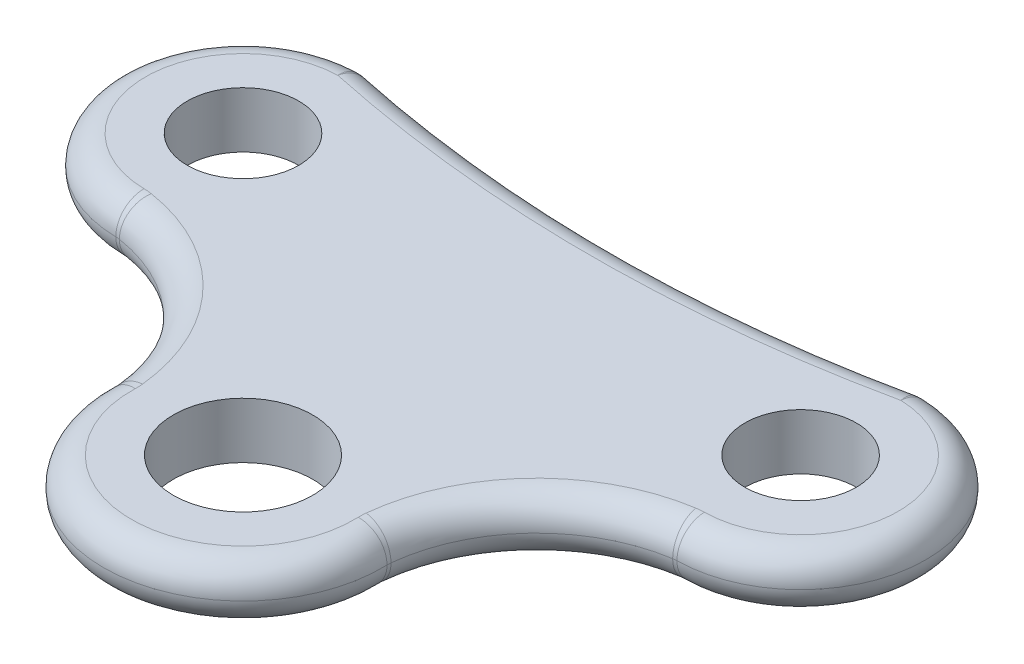
ISO-10303-21;
HEADER;
FILE_DESCRIPTION(('STEP AP214'),'2;1');
FILE_NAME('part.step','',(''),(''),'','','');
FILE_SCHEMA(('AUTOMOTIVE_DESIGN { 1 0 10303 214 1 1 1 1 }'));
ENDSEC;
DATA;
#1=APPLICATION_CONTEXT('core data for automotive mechanical design processes');
#2=APPLICATION_PROTOCOL_DEFINITION('international standard','automotive_design',2000,#1);
#3=PRODUCT_CONTEXT('',#1,'mechanical');
#4=PRODUCT('Part','Part','',(#3));
#5=PRODUCT_RELATED_PRODUCT_CATEGORY('part','',(#4));
#6=PRODUCT_DEFINITION_FORMATION('','',#4);
#7=PRODUCT_DEFINITION_CONTEXT('part definition',#1,'design');
#8=PRODUCT_DEFINITION('design','',#6,#7);
#9=PRODUCT_DEFINITION_SHAPE('','',#8);
#10=(LENGTH_UNIT() NAMED_UNIT(*) SI_UNIT(.MILLI.,.METRE.));
#11=(NAMED_UNIT(*) PLANE_ANGLE_UNIT() SI_UNIT($,.RADIAN.));
#12=(NAMED_UNIT(*) SI_UNIT($,.STERADIAN.) SOLID_ANGLE_UNIT());
#13=UNCERTAINTY_MEASURE_WITH_UNIT(LENGTH_MEASURE(1.E-05),#10,'distance_accuracy_value','');
#14=(GEOMETRIC_REPRESENTATION_CONTEXT(3) GLOBAL_UNCERTAINTY_ASSIGNED_CONTEXT((#13)) GLOBAL_UNIT_ASSIGNED_CONTEXT((#10,
#11,#12)) REPRESENTATION_CONTEXT('',''));
#15=CARTESIAN_POINT('',(0.,0.,0.));
#16=DIRECTION('',(0.,0.,1.));
#17=DIRECTION('',(1.,0.,0.));
#18=AXIS2_PLACEMENT_3D('',#15,#16,#17);
#19=CARTESIAN_POINT('',(-20.8323817746061,4.,-9.69746398010137));
#20=DIRECTION('',(0.,1.,0.));
#21=DIRECTION('',(0.,0.,1.));
#22=AXIS2_PLACEMENT_3D('',#19,#20,#21);
#23=PLANE('',#22);
#24=CARTESIAN_POINT('',(-20.1565010770898,4.,-9.0011133557587));
#25=DIRECTION('',(0.,1.,0.));
#26=DIRECTION('',(0.,0.,1.));
#27=AXIS2_PLACEMENT_3D('',#24,#25,#26);
#28=CIRCLE('',#27,4.);
#29=CARTESIAN_POINT('',(-19.5360639769768,4.,-12.9527026315822));
#30=VERTEX_POINT('',#29);
#31=CARTESIAN_POINT('',(-20.0995915945117,4.,-13.0007084991192));
#32=VERTEX_POINT('',#31);
#33=EDGE_CURVE('E318',#30,#32,#28,.T.);
#34=ORIENTED_EDGE('',*,*,#33,.F.);
#35=CARTESIAN_POINT('',(-21.6647635492123,4.,0.605072039797253));
#36=DIRECTION('',(0.,1.,0.));
#37=DIRECTION('',(0.,0.,1.));
#38=AXIS2_PLACEMENT_3D('',#35,#36,#37);
#39=CIRCLE('',#38,13.7238702962661);
#40=CARTESIAN_POINT('',(-8.01478016611198,4.,-0.817098677739674));
#41=VERTEX_POINT('',#40);
#42=EDGE_CURVE('E324',#30,#41,#39,.F.);
#43=ORIENTED_EDGE('',*,*,#42,.T.);
#44=CARTESIAN_POINT('',(-11.9932448669374,4.,-0.402588576190881));
#45=DIRECTION('',(0.,1.,0.));
#46=DIRECTION('',(0.,0.,1.));
#47=AXIS2_PLACEMENT_3D('',#44,#45,#46);
#48=CIRCLE('',#47,4.);
#49=CARTESIAN_POINT('',(-7.99549657795828,4.,-0.268392384127254));
#50=VERTEX_POINT('',#49);
#51=EDGE_CURVE('E321',#50,#41,#48,.T.);
#52=ORIENTED_EDGE('',*,*,#51,.F.);
#53=CARTESIAN_POINT('',(0.,4.,0.));
#54=DIRECTION('',(0.,1.,0.));
#55=DIRECTION('',(0.,0.,1.));
#56=AXIS2_PLACEMENT_3D('',#53,#54,#55);
#57=CIRCLE('',#56,8.);
#58=CARTESIAN_POINT('',(7.99549657795827,4.,-0.268392384127281));
#59=VERTEX_POINT('',#58);
#60=EDGE_CURVE('E316',#50,#59,#57,.T.);
#61=ORIENTED_EDGE('',*,*,#60,.T.);
#62=CARTESIAN_POINT('',(11.9932448669374,4.,-0.402588576190921));
#63=DIRECTION('',(0.,1.,0.));
#64=DIRECTION('',(0.,0.,1.));
#65=AXIS2_PLACEMENT_3D('',#62,#63,#64);
#66=CIRCLE('',#65,4.);
#67=CARTESIAN_POINT('',(8.01478016611198,4.,-0.817098677739704));
#68=VERTEX_POINT('',#67);
#69=EDGE_CURVE('E313',#68,#59,#66,.T.);
#70=ORIENTED_EDGE('',*,*,#69,.F.);
#71=CARTESIAN_POINT('',(21.6647635492122,4.,0.605072039797178));
#72=DIRECTION('',(0.,1.,0.));
#73=DIRECTION('',(0.,0.,1.));
#74=AXIS2_PLACEMENT_3D('',#71,#72,#73);
#75=CIRCLE('',#74,13.723870296266);
#76=CARTESIAN_POINT('',(19.5360639769768,4.,-12.9527026315822));
#77=VERTEX_POINT('',#76);
#78=EDGE_CURVE('E311',#68,#77,#75,.F.);
#79=ORIENTED_EDGE('',*,*,#78,.T.);
#80=CARTESIAN_POINT('',(20.1565010770897,4.,-9.0011133557587));
#81=DIRECTION('',(0.,1.,0.));
#82=DIRECTION('',(0.,0.,1.));
#83=AXIS2_PLACEMENT_3D('',#80,#81,#82);
#84=CIRCLE('',#83,4.);
#85=CARTESIAN_POINT('',(20.0995915945116,4.,-13.0007084991192));
#86=VERTEX_POINT('',#85);
#87=EDGE_CURVE('E308',#86,#77,#84,.T.);
#88=ORIENTED_EDGE('',*,*,#87,.F.);
#89=CARTESIAN_POINT('',(20.,4.,-20.));
#90=DIRECTION('',(0.,1.,0.));
#91=DIRECTION('',(0.,0.,1.));
#92=AXIS2_PLACEMENT_3D('',#89,#90,#91);
#93=CIRCLE('',#92,7.);
#94=CARTESIAN_POINT('',(20.1992785128255,4.,-26.9971628589255));
#95=VERTEX_POINT('',#94);
#96=EDGE_CURVE('E107',#86,#95,#93,.T.);
#97=ORIENTED_EDGE('',*,*,#96,.T.);
#98=CARTESIAN_POINT('',(0.,4.,-121.529007777522));
#99=DIRECTION('',(0.,1.,0.));
#100=DIRECTION('',(0.,0.,1.));
#101=AXIS2_PLACEMENT_3D('',#98,#99,#100);
#102=CIRCLE('',#101,96.6658189648865);
#103=CARTESIAN_POINT('',(-20.1992785128254,4.,-26.9971628589255));
#104=VERTEX_POINT('',#103);
#105=EDGE_CURVE('E301',#95,#104,#102,.F.);
#106=ORIENTED_EDGE('',*,*,#105,.T.);
#107=CARTESIAN_POINT('',(-20.,4.,-20.));
#108=DIRECTION('',(0.,1.,0.));
#109=DIRECTION('',(0.,0.,1.));
#110=AXIS2_PLACEMENT_3D('',#107,#108,#109);
#111=CIRCLE('',#110,7.);
#112=EDGE_CURVE('E306',#104,#32,#111,.T.);
#113=ORIENTED_EDGE('',*,*,#112,.T.);
#114=EDGE_LOOP('',(#34,#43,#52,#61,#70,#79,#88,#97,#106,#113));
#115=FACE_BOUND('',#114,.T.);
#116=CARTESIAN_POINT('',(-20.,4.,-20.));
#117=DIRECTION('',(0.,1.,0.));
#118=DIRECTION('',(0.,0.,1.));
#119=AXIS2_PLACEMENT_3D('',#116,#117,#118);
#120=CIRCLE('',#119,4.);
#121=CARTESIAN_POINT('',(-20.,4.,-16.));
#122=VERTEX_POINT('',#121);
#123=EDGE_CURVE('E292',#122,#122,#120,.T.);
#124=ORIENTED_EDGE('',*,*,#123,.F.);
#125=EDGE_LOOP('',(#124));
#126=FACE_BOUND('',#125,.T.);
#127=CARTESIAN_POINT('',(0.,4.,0.));
#128=DIRECTION('',(0.,1.,0.));
#129=DIRECTION('',(0.,0.,1.));
#130=AXIS2_PLACEMENT_3D('',#127,#128,#129);
#131=CIRCLE('',#130,5.);
#132=CARTESIAN_POINT('',(0.,4.,5.));
#133=VERTEX_POINT('',#132);
#134=EDGE_CURVE('E298',#133,#133,#131,.T.);
#135=ORIENTED_EDGE('',*,*,#134,.F.);
#136=EDGE_LOOP('',(#135));
#137=FACE_BOUND('',#136,.T.);
#138=CARTESIAN_POINT('',(20.,4.,-20.));
#139=DIRECTION('',(0.,1.,0.));
#140=DIRECTION('',(0.,0.,1.));
#141=AXIS2_PLACEMENT_3D('',#138,#139,#140);
#142=CIRCLE('',#141,4.);
#143=CARTESIAN_POINT('',(20.,4.,-16.));
#144=VERTEX_POINT('',#143);
#145=EDGE_CURVE('E284',#144,#144,#142,.T.);
#146=ORIENTED_EDGE('',*,*,#145,.F.);
#147=EDGE_LOOP('',(#146));
#148=FACE_BOUND('',#147,.T.);
#149=ADVANCED_FACE('F36',(#115,#126,#137,#148),#23,.T.);
#150=CARTESIAN_POINT('',(-20.8323817746061,0.,-9.69746398010137));
#151=DIRECTION('',(0.,1.,0.));
#152=DIRECTION('',(0.,0.,1.));
#153=AXIS2_PLACEMENT_3D('',#150,#151,#152);
#154=PLANE('',#153);
#155=CARTESIAN_POINT('',(20.1565010770897,0.,-9.0011133557587));
#156=DIRECTION('',(0.,1.,0.));
#157=DIRECTION('',(0.,0.,1.));
#158=AXIS2_PLACEMENT_3D('',#155,#156,#157);
#159=CIRCLE('',#158,4.);
#160=CARTESIAN_POINT('',(19.5360639769768,0.,-12.9527026315822));
#161=VERTEX_POINT('',#160);
#162=CARTESIAN_POINT('',(20.0995915945116,0.,-13.0007084991192));
#163=VERTEX_POINT('',#162);
#164=EDGE_CURVE('E182',#161,#163,#159,.F.);
#165=ORIENTED_EDGE('',*,*,#164,.F.);
#166=CARTESIAN_POINT('',(21.6647635492122,0.,0.605072039797178));
#167=DIRECTION('',(0.,1.,0.));
#168=DIRECTION('',(0.,0.,1.));
#169=AXIS2_PLACEMENT_3D('',#166,#167,#168);
#170=CIRCLE('',#169,13.723870296266);
#171=CARTESIAN_POINT('',(8.01478016611198,0.,-0.817098677739704));
#172=VERTEX_POINT('',#171);
#173=EDGE_CURVE('E11',#161,#172,#170,.T.);
#174=ORIENTED_EDGE('',*,*,#173,.T.);
#175=CARTESIAN_POINT('',(11.9932448669374,0.,-0.402588576190921));
#176=DIRECTION('',(0.,1.,0.));
#177=DIRECTION('',(0.,0.,1.));
#178=AXIS2_PLACEMENT_3D('',#175,#176,#177);
#179=CIRCLE('',#178,4.);
#180=CARTESIAN_POINT('',(7.99549657795827,0.,-0.268392384127281));
#181=VERTEX_POINT('',#180);
#182=EDGE_CURVE('E46',#181,#172,#179,.F.);
#183=ORIENTED_EDGE('',*,*,#182,.F.);
#184=CARTESIAN_POINT('',(0.,0.,0.));
#185=DIRECTION('',(0.,1.,0.));
#186=DIRECTION('',(0.,0.,1.));
#187=AXIS2_PLACEMENT_3D('',#184,#185,#186);
#188=CIRCLE('',#187,8.);
#189=CARTESIAN_POINT('',(-7.99549657795828,0.,-0.268392384127254));
#190=VERTEX_POINT('',#189);
#191=EDGE_CURVE('E155',#181,#190,#188,.F.);
#192=ORIENTED_EDGE('',*,*,#191,.T.);
#193=CARTESIAN_POINT('',(-11.9932448669374,0.,-0.402588576190881));
#194=DIRECTION('',(0.,1.,0.));
#195=DIRECTION('',(0.,0.,1.));
#196=AXIS2_PLACEMENT_3D('',#193,#194,#195);
#197=CIRCLE('',#196,4.);
#198=CARTESIAN_POINT('',(-8.01478016611198,0.,-0.817098677739674));
#199=VERTEX_POINT('',#198);
#200=EDGE_CURVE('E161',#199,#190,#197,.F.);
#201=ORIENTED_EDGE('',*,*,#200,.F.);
#202=CARTESIAN_POINT('',(-21.6647635492123,0.,0.605072039797253));
#203=DIRECTION('',(0.,1.,0.));
#204=DIRECTION('',(0.,0.,1.));
#205=AXIS2_PLACEMENT_3D('',#202,#203,#204);
#206=CIRCLE('',#205,13.7238702962661);
#207=CARTESIAN_POINT('',(-19.5360639769768,0.,-12.9527026315822));
#208=VERTEX_POINT('',#207);
#209=EDGE_CURVE('E185',#199,#208,#206,.T.);
#210=ORIENTED_EDGE('',*,*,#209,.T.);
#211=CARTESIAN_POINT('',(-20.1565010770898,0.,-9.0011133557587));
#212=DIRECTION('',(0.,1.,0.));
#213=DIRECTION('',(0.,0.,1.));
#214=AXIS2_PLACEMENT_3D('',#211,#212,#213);
#215=CIRCLE('',#214,4.);
#216=CARTESIAN_POINT('',(-20.0995915945117,0.,-13.0007084991192));
#217=VERTEX_POINT('',#216);
#218=EDGE_CURVE('E333',#217,#208,#215,.F.);
#219=ORIENTED_EDGE('',*,*,#218,.F.);
#220=CARTESIAN_POINT('',(-20.,0.,-20.));
#221=DIRECTION('',(0.,1.,0.));
#222=DIRECTION('',(0.,0.,1.));
#223=AXIS2_PLACEMENT_3D('',#220,#221,#222);
#224=CIRCLE('',#223,7.);
#225=CARTESIAN_POINT('',(-20.1992785128254,0.,-26.9971628589255));
#226=VERTEX_POINT('',#225);
#227=EDGE_CURVE('E331',#217,#226,#224,.F.);
#228=ORIENTED_EDGE('',*,*,#227,.T.);
#229=CARTESIAN_POINT('',(0.,0.,-121.529007777522));
#230=DIRECTION('',(0.,1.,0.));
#231=DIRECTION('',(0.,0.,1.));
#232=AXIS2_PLACEMENT_3D('',#229,#230,#231);
#233=CIRCLE('',#232,96.6658189648865);
#234=CARTESIAN_POINT('',(20.1992785128255,0.,-26.9971628589255));
#235=VERTEX_POINT('',#234);
#236=EDGE_CURVE('E327',#226,#235,#233,.T.);
#237=ORIENTED_EDGE('',*,*,#236,.T.);
#238=CARTESIAN_POINT('',(20.,0.,-20.));
#239=DIRECTION('',(0.,1.,0.));
#240=DIRECTION('',(0.,0.,1.));
#241=AXIS2_PLACEMENT_3D('',#238,#239,#240);
#242=CIRCLE('',#241,7.);
#243=EDGE_CURVE('E329',#235,#163,#242,.F.);
#244=ORIENTED_EDGE('',*,*,#243,.T.);
#245=EDGE_LOOP('',(#165,#174,#183,#192,#201,#210,#219,#228,#237,#244));
#246=FACE_BOUND('',#245,.T.);
#247=CARTESIAN_POINT('',(-20.,0.,-20.));
#248=DIRECTION('',(0.,1.,0.));
#249=DIRECTION('',(0.,0.,1.));
#250=AXIS2_PLACEMENT_3D('',#247,#248,#249);
#251=CIRCLE('',#250,4.);
#252=CARTESIAN_POINT('',(-20.,0.,-16.));
#253=VERTEX_POINT('',#252);
#254=EDGE_CURVE('E289',#253,#253,#251,.T.);
#255=ORIENTED_EDGE('',*,*,#254,.T.);
#256=EDGE_LOOP('',(#255));
#257=FACE_BOUND('',#256,.T.);
#258=CARTESIAN_POINT('',(0.,0.,0.));
#259=DIRECTION('',(0.,1.,0.));
#260=DIRECTION('',(0.,0.,1.));
#261=AXIS2_PLACEMENT_3D('',#258,#259,#260);
#262=CIRCLE('',#261,5.);
#263=CARTESIAN_POINT('',(0.,0.,5.));
#264=VERTEX_POINT('',#263);
#265=EDGE_CURVE('E295',#264,#264,#262,.T.);
#266=ORIENTED_EDGE('',*,*,#265,.T.);
#267=EDGE_LOOP('',(#266));
#268=FACE_BOUND('',#267,.T.);
#269=CARTESIAN_POINT('',(20.,0.,-20.));
#270=DIRECTION('',(0.,1.,0.));
#271=DIRECTION('',(0.,0.,1.));
#272=AXIS2_PLACEMENT_3D('',#269,#270,#271);
#273=CIRCLE('',#272,4.);
#274=CARTESIAN_POINT('',(20.,0.,-16.));
#275=VERTEX_POINT('',#274);
#276=EDGE_CURVE('E281',#275,#275,#273,.T.);
#277=ORIENTED_EDGE('',*,*,#276,.T.);
#278=EDGE_LOOP('',(#277));
#279=FACE_BOUND('',#278,.T.);
#280=ADVANCED_FACE('F157',(#246,#257,#268,#279),#154,.F.);
#281=CARTESIAN_POINT('',(0.,4.,0.));
#282=DIRECTION('',(0.,-1.,0.));
#283=DIRECTION('',(0.,0.,-1.));
#284=AXIS2_PLACEMENT_3D('',#281,#282,#283);
#285=CYLINDRICAL_SURFACE('',#284,5.);
#286=ORIENTED_EDGE('',*,*,#134,.T.);
#287=EDGE_LOOP('',(#286));
#288=FACE_BOUND('',#287,.T.);
#289=ORIENTED_EDGE('',*,*,#265,.F.);
#290=EDGE_LOOP('',(#289));
#291=FACE_BOUND('',#290,.T.);
#292=ADVANCED_FACE('F404',(#288,#291),#285,.F.);
#293=CARTESIAN_POINT('',(-20.,4.,-20.));
#294=DIRECTION('',(0.,-1.,0.));
#295=DIRECTION('',(0.,0.,-1.));
#296=AXIS2_PLACEMENT_3D('',#293,#294,#295);
#297=CYLINDRICAL_SURFACE('',#296,4.);
#298=ORIENTED_EDGE('',*,*,#123,.T.);
#299=EDGE_LOOP('',(#298));
#300=FACE_BOUND('',#299,.T.);
#301=ORIENTED_EDGE('',*,*,#254,.F.);
#302=EDGE_LOOP('',(#301));
#303=FACE_BOUND('',#302,.T.);
#304=ADVANCED_FACE('F456',(#300,#303),#297,.F.);
#305=CARTESIAN_POINT('',(20.,4.,-20.));
#306=DIRECTION('',(0.,-1.,0.));
#307=DIRECTION('',(0.,0.,-1.));
#308=AXIS2_PLACEMENT_3D('',#305,#306,#307);
#309=CYLINDRICAL_SURFACE('',#308,4.);
#310=ORIENTED_EDGE('',*,*,#145,.T.);
#311=EDGE_LOOP('',(#310));
#312=FACE_BOUND('',#311,.T.);
#313=ORIENTED_EDGE('',*,*,#276,.F.);
#314=EDGE_LOOP('',(#313));
#315=FACE_BOUND('',#314,.T.);
#316=ADVANCED_FACE('F451',(#312,#315),#309,.F.);
#317=CARTESIAN_POINT('',(20.,2.,-20.));
#318=DIRECTION('',(0.,1.,0.));
#319=DIRECTION('',(0.,0.,1.));
#320=AXIS2_PLACEMENT_3D('',#317,#318,#319);
#321=TOROIDAL_SURFACE('',#320,7.,2.);
#322=CARTESIAN_POINT('',(20.1992785128255,2.,-26.9971628589255));
#323=DIRECTION('',(-0.99959469413221,0.,-0.0284683589750721));
#324=DIRECTION('',(-0.0284683589750721,0.,0.99959469413221));
#325=AXIS2_PLACEMENT_3D('',#322,#323,#324);
#326=CIRCLE('',#325,2.);
#327=CARTESIAN_POINT('',(20.2562152307756,2.,-28.9963522471899));
#328=VERTEX_POINT('',#327);
#329=EDGE_CURVE('E40',#328,#235,#326,.T.);
#330=ORIENTED_EDGE('',*,*,#329,.F.);
#331=CARTESIAN_POINT('',(20.,2.,-20.));
#332=DIRECTION('',(0.,1.,0.));
#333=DIRECTION('',(0.,0.,1.));
#334=AXIS2_PLACEMENT_3D('',#331,#332,#333);
#335=CIRCLE('',#334,9.);
#336=CARTESIAN_POINT('',(20.1280463358007,2.,-11.0009109274389));
#337=VERTEX_POINT('',#336);
#338=EDGE_CURVE('E98',#337,#328,#335,.T.);
#339=ORIENTED_EDGE('',*,*,#338,.F.);
#340=CARTESIAN_POINT('',(20.0995915945116,2.,-13.0007084991192));
#341=DIRECTION('',(-0.999898785840119,0.,0.0142273706445224));
#342=DIRECTION('',(0.0142273706445224,0.,0.999898785840119));
#343=AXIS2_PLACEMENT_3D('',#340,#341,#342);
#344=CIRCLE('',#343,2.);
#345=EDGE_CURVE('E273',#163,#337,#344,.T.);
#346=ORIENTED_EDGE('',*,*,#345,.F.);
#347=ORIENTED_EDGE('',*,*,#243,.F.);
#348=EDGE_LOOP('',(#330,#339,#346,#347));
#349=FACE_BOUND('',#348,.T.);
#350=ADVANCED_FACE('F38',(#349),#321,.T.);
#351=CARTESIAN_POINT('',(20.1992785128255,2.,-26.9971628589255));
#352=DIRECTION('',(0.,0.,1.));
#353=DIRECTION('',(1.,0.,0.));
#354=AXIS2_PLACEMENT_3D('',#351,#352,#353);
#355=SPHERICAL_SURFACE('',#354,2.);
#356=CARTESIAN_POINT('',(20.1992785128255,2.,-26.9971628589255));
#357=DIRECTION('',(0.,-1.,0.));
#358=DIRECTION('',(0.,0.,-1.));
#359=AXIS2_PLACEMENT_3D('',#356,#357,#358);
#360=CIRCLE('',#359,2.);
#361=CARTESIAN_POINT('',(19.7813587407877,2.,-28.9530112845812));
#362=VERTEX_POINT('',#361);
#363=EDGE_CURVE('E276',#328,#362,#360,.F.);
#364=ORIENTED_EDGE('',*,*,#363,.F.);
#365=ORIENTED_EDGE('',*,*,#329,.T.);
#366=CARTESIAN_POINT('',(20.1992785128255,2.,-26.9971628589255));
#367=DIRECTION('',(0.977924212827855,0.,-0.208959886018872));
#368=DIRECTION('',(-0.208959886018872,0.,-0.977924212827855));
#369=AXIS2_PLACEMENT_3D('',#366,#367,#368);
#370=CIRCLE('',#369,2.);
#371=EDGE_CURVE('E270',#362,#235,#370,.F.);
#372=ORIENTED_EDGE('',*,*,#371,.F.);
#373=EDGE_LOOP('',(#364,#365,#372));
#374=FACE_BOUND('',#373,.T.);
#375=ADVANCED_FACE('F450',(#374),#355,.T.);
#376=CARTESIAN_POINT('',(20.,2.,-20.));
#377=DIRECTION('',(0.,1.,0.));
#378=DIRECTION('',(0.,0.,1.));
#379=AXIS2_PLACEMENT_3D('',#376,#377,#378);
#380=TOROIDAL_SURFACE('',#379,7.,2.);
#381=CARTESIAN_POINT('',(20.0995915945116,2.,-13.0007084991192));
#382=DIRECTION('',(-0.999898785840119,0.,0.0142273706445224));
#383=DIRECTION('',(0.0142273706445224,0.,0.999898785840119));
#384=AXIS2_PLACEMENT_3D('',#381,#382,#383);
#385=CIRCLE('',#384,2.);
#386=EDGE_CURVE('E264',#337,#86,#385,.T.);
#387=ORIENTED_EDGE('',*,*,#386,.F.);
#388=ORIENTED_EDGE('',*,*,#338,.T.);
#389=CARTESIAN_POINT('',(20.1992785128255,2.,-26.9971628589255));
#390=DIRECTION('',(-0.999594694132209,0.,-0.0284683589750912));
#391=DIRECTION('',(-0.0284683589750912,0.,0.99959469413221));
#392=AXIS2_PLACEMENT_3D('',#389,#390,#391);
#393=CIRCLE('',#392,2.);
#394=EDGE_CURVE('E267',#95,#328,#393,.T.);
#395=ORIENTED_EDGE('',*,*,#394,.F.);
#396=ORIENTED_EDGE('',*,*,#96,.F.);
#397=EDGE_LOOP('',(#387,#388,#395,#396));
#398=FACE_BOUND('',#397,.T.);
#399=ADVANCED_FACE('F387',(#398),#380,.T.);
#400=CARTESIAN_POINT('',(20.1565010770897,2.,-9.0011133557587));
#401=DIRECTION('',(0.,1.,0.));
#402=DIRECTION('',(0.,0.,1.));
#403=AXIS2_PLACEMENT_3D('',#400,#401,#402);
#404=TOROIDAL_SURFACE('',#403,4.,2.);
#405=ORIENTED_EDGE('',*,*,#345,.T.);
#406=CARTESIAN_POINT('',(20.1565010770897,2.,-9.0011133557587));
#407=DIRECTION('',(0.,1.,0.));
#408=DIRECTION('',(0.,0.,1.));
#409=AXIS2_PLACEMENT_3D('',#406,#407,#408);
#410=CIRCLE('',#409,2.);
#411=CARTESIAN_POINT('',(19.8462825270333,2.,-10.9769079936705));
#412=VERTEX_POINT('',#411);
#413=EDGE_CURVE('E262',#412,#337,#410,.F.);
#414=ORIENTED_EDGE('',*,*,#413,.F.);
#415=CARTESIAN_POINT('',(19.5360639769768,2.,-12.9527026315822));
#416=DIRECTION('',(0.987897318955879,0.,-0.155109275028242));
#417=DIRECTION('',(-0.155109275028242,0.,-0.987897318955879));
#418=AXIS2_PLACEMENT_3D('',#415,#416,#417);
#419=CIRCLE('',#418,2.);
#420=EDGE_CURVE('E259',#161,#412,#419,.F.);
#421=ORIENTED_EDGE('',*,*,#420,.F.);
#422=ORIENTED_EDGE('',*,*,#164,.T.);
#423=EDGE_LOOP('',(#405,#414,#421,#422));
#424=FACE_BOUND('',#423,.T.);
#425=ADVANCED_FACE('F397',(#424),#404,.T.);
#426=CARTESIAN_POINT('',(0.,2.,-121.529007777522));
#427=DIRECTION('',(0.,1.,0.));
#428=DIRECTION('',(0.,0.,1.));
#429=AXIS2_PLACEMENT_3D('',#426,#427,#428);
#430=TOROIDAL_SURFACE('',#429,96.6658189648865,2.);
#431=ORIENTED_EDGE('',*,*,#371,.T.);
#432=ORIENTED_EDGE('',*,*,#236,.F.);
#433=CARTESIAN_POINT('',(-20.1992785128255,2.,-26.9971628589255));
#434=DIRECTION('',(-0.977924212827851,0.,-0.208959886018892));
#435=DIRECTION('',(-0.208959886018892,0.,0.977924212827851));
#436=AXIS2_PLACEMENT_3D('',#433,#434,#435);
#437=CIRCLE('',#436,2.);
#438=CARTESIAN_POINT('',(-19.7813587407877,2.,-28.9530112845812));
#439=VERTEX_POINT('',#438);
#440=EDGE_CURVE('E256',#439,#226,#437,.T.);
#441=ORIENTED_EDGE('',*,*,#440,.F.);
#442=CARTESIAN_POINT('',(0.,2.,-121.529007777522));
#443=DIRECTION('',(0.,1.,0.));
#444=DIRECTION('',(0.,0.,1.));
#445=AXIS2_PLACEMENT_3D('',#442,#443,#444);
#446=CIRCLE('',#445,94.6658189648865);
#447=EDGE_CURVE('E250',#362,#439,#446,.F.);
#448=ORIENTED_EDGE('',*,*,#447,.F.);
#449=EDGE_LOOP('',(#431,#432,#441,#448));
#450=FACE_BOUND('',#449,.T.);
#451=ADVANCED_FACE('F347',(#450),#430,.T.);
#452=CARTESIAN_POINT('',(20.1992785128255,2.,-26.9971628589255));
#453=DIRECTION('',(0.,0.,1.));
#454=DIRECTION('',(1.,0.,0.));
#455=AXIS2_PLACEMENT_3D('',#452,#453,#454);
#456=SPHERICAL_SURFACE('',#455,2.);
#457=ORIENTED_EDGE('',*,*,#394,.T.);
#458=ORIENTED_EDGE('',*,*,#363,.T.);
#459=CARTESIAN_POINT('',(20.1992785128255,2.,-26.9971628589255));
#460=DIRECTION('',(0.977924212827851,0.,-0.208959886018892));
#461=DIRECTION('',(-0.208959886018892,0.,-0.977924212827851));
#462=AXIS2_PLACEMENT_3D('',#459,#460,#461);
#463=CIRCLE('',#462,2.);
#464=EDGE_CURVE('E247',#95,#362,#463,.F.);
#465=ORIENTED_EDGE('',*,*,#464,.F.);
#466=EDGE_LOOP('',(#457,#458,#465));
#467=FACE_BOUND('',#466,.T.);
#468=ADVANCED_FACE('F388',(#467),#456,.T.);
#469=CARTESIAN_POINT('',(20.1565010770897,2.,-9.0011133557587));
#470=DIRECTION('',(0.,1.,0.));
#471=DIRECTION('',(0.,0.,1.));
#472=AXIS2_PLACEMENT_3D('',#469,#470,#471);
#473=TOROIDAL_SURFACE('',#472,4.,2.);
#474=ORIENTED_EDGE('',*,*,#386,.T.);
#475=ORIENTED_EDGE('',*,*,#87,.T.);
#476=CARTESIAN_POINT('',(19.5360639769768,2.,-12.9527026315822));
#477=DIRECTION('',(0.987897318955879,0.,-0.155109275028242));
#478=DIRECTION('',(-0.155109275028242,0.,-0.987897318955879));
#479=AXIS2_PLACEMENT_3D('',#476,#477,#478);
#480=CIRCLE('',#479,2.);
#481=EDGE_CURVE('E244',#412,#77,#480,.F.);
#482=ORIENTED_EDGE('',*,*,#481,.F.);
#483=ORIENTED_EDGE('',*,*,#413,.T.);
#484=EDGE_LOOP('',(#474,#475,#482,#483));
#485=FACE_BOUND('',#484,.T.);
#486=ADVANCED_FACE('F384',(#485),#473,.T.);
#487=CARTESIAN_POINT('',(21.6647635492122,2.,0.605072039797178));
#488=DIRECTION('',(0.,1.,0.));
#489=DIRECTION('',(0.,0.,1.));
#490=AXIS2_PLACEMENT_3D('',#487,#488,#489);
#491=TOROIDAL_SURFACE('',#490,13.723870296266,2.);
#492=ORIENTED_EDGE('',*,*,#173,.F.);
#493=ORIENTED_EDGE('',*,*,#420,.T.);
#494=CARTESIAN_POINT('',(21.6647635492122,2.,0.605072039797178));
#495=DIRECTION('',(0.,1.,0.));
#496=DIRECTION('',(0.,0.,1.));
#497=AXIS2_PLACEMENT_3D('',#494,#495,#496);
#498=CIRCLE('',#497,11.723870296266);
#499=CARTESIAN_POINT('',(10.0040125165247,2.,-0.609843626965312));
#500=VERTEX_POINT('',#499);
#501=EDGE_CURVE('E241',#500,#412,#498,.F.);
#502=ORIENTED_EDGE('',*,*,#501,.F.);
#503=CARTESIAN_POINT('',(8.01478016611198,2.,-0.817098677739704));
#504=DIRECTION('',(-0.103627525387196,0.,0.994616175206359));
#505=DIRECTION('',(0.994616175206359,0.,0.103627525387196));
#506=AXIS2_PLACEMENT_3D('',#503,#504,#505);
#507=CIRCLE('',#506,2.);
#508=EDGE_CURVE('E238',#172,#500,#507,.T.);
#509=ORIENTED_EDGE('',*,*,#508,.F.);
#510=EDGE_LOOP('',(#492,#493,#502,#509));
#511=FACE_BOUND('',#510,.T.);
#512=ADVANCED_FACE('F395',(#511),#491,.T.);
#513=CARTESIAN_POINT('',(-20.1992785128255,2.,-26.9971628589255));
#514=DIRECTION('',(0.,0.,1.));
#515=DIRECTION('',(1.,0.,0.));
#516=AXIS2_PLACEMENT_3D('',#513,#514,#515);
#517=SPHERICAL_SURFACE('',#516,2.);
#518=CARTESIAN_POINT('',(-20.1992785128255,2.,-26.9971628589255));
#519=DIRECTION('',(0.,-1.,0.));
#520=DIRECTION('',(0.,0.,-1.));
#521=AXIS2_PLACEMENT_3D('',#518,#519,#520);
#522=CIRCLE('',#521,2.);
#523=CARTESIAN_POINT('',(-20.2562152307757,2.,-28.9963522471899));
#524=VERTEX_POINT('',#523);
#525=EDGE_CURVE('E253',#439,#524,#522,.F.);
#526=ORIENTED_EDGE('',*,*,#525,.F.);
#527=ORIENTED_EDGE('',*,*,#440,.T.);
#528=CARTESIAN_POINT('',(-20.1992785128254,2.,-26.9971628589255));
#529=DIRECTION('',(0.999594694132209,0.,-0.0284683589751137));
#530=DIRECTION('',(-0.0284683589751138,0.,-0.999594694132209));
#531=AXIS2_PLACEMENT_3D('',#528,#529,#530);
#532=CIRCLE('',#531,2.);
#533=EDGE_CURVE('E235',#524,#226,#532,.F.);
#534=ORIENTED_EDGE('',*,*,#533,.F.);
#535=EDGE_LOOP('',(#526,#527,#534));
#536=FACE_BOUND('',#535,.T.);
#537=ADVANCED_FACE('F350',(#536),#517,.T.);
#538=CARTESIAN_POINT('',(0.,2.,-121.529007777522));
#539=DIRECTION('',(0.,1.,0.));
#540=DIRECTION('',(0.,0.,1.));
#541=AXIS2_PLACEMENT_3D('',#538,#539,#540);
#542=TOROIDAL_SURFACE('',#541,96.6658189648865,2.);
#543=ORIENTED_EDGE('',*,*,#464,.T.);
#544=ORIENTED_EDGE('',*,*,#447,.T.);
#545=CARTESIAN_POINT('',(-20.1992785128254,2.,-26.9971628589255));
#546=DIRECTION('',(-0.977924212827859,0.,-0.208959886018855));
#547=DIRECTION('',(-0.208959886018855,0.,0.977924212827859));
#548=AXIS2_PLACEMENT_3D('',#545,#546,#547);
#549=CIRCLE('',#548,2.);
#550=EDGE_CURVE('E232',#104,#439,#549,.T.);
#551=ORIENTED_EDGE('',*,*,#550,.F.);
#552=ORIENTED_EDGE('',*,*,#105,.F.);
#553=EDGE_LOOP('',(#543,#544,#551,#552));
#554=FACE_BOUND('',#553,.T.);
#555=ADVANCED_FACE('F355',(#554),#542,.T.);
#556=CARTESIAN_POINT('',(21.6647635492122,2.,0.605072039797178));
#557=DIRECTION('',(0.,1.,0.));
#558=DIRECTION('',(0.,0.,1.));
#559=AXIS2_PLACEMENT_3D('',#556,#557,#558);
#560=TOROIDAL_SURFACE('',#559,13.723870296266,2.);
#561=CARTESIAN_POINT('',(8.01478016611198,2.,-0.817098677739704));
#562=DIRECTION('',(-0.103627525387196,0.,0.994616175206359));
#563=DIRECTION('',(0.994616175206359,0.,0.103627525387196));
#564=AXIS2_PLACEMENT_3D('',#561,#562,#563);
#565=CIRCLE('',#564,2.);
#566=EDGE_CURVE('E229',#500,#68,#565,.T.);
#567=ORIENTED_EDGE('',*,*,#566,.F.);
#568=ORIENTED_EDGE('',*,*,#501,.T.);
#569=ORIENTED_EDGE('',*,*,#481,.T.);
#570=ORIENTED_EDGE('',*,*,#78,.F.);
#571=EDGE_LOOP('',(#567,#568,#569,#570));
#572=FACE_BOUND('',#571,.T.);
#573=ADVANCED_FACE('F381',(#572),#560,.T.);
#574=CARTESIAN_POINT('',(11.9932448669374,2.,-0.402588576190921));
#575=DIRECTION('',(0.,1.,0.));
#576=DIRECTION('',(0.,0.,1.));
#577=AXIS2_PLACEMENT_3D('',#574,#575,#576);
#578=TOROIDAL_SURFACE('',#577,4.,2.);
#579=ORIENTED_EDGE('',*,*,#508,.T.);
#580=CARTESIAN_POINT('',(11.9932448669374,2.,-0.402588576190921));
#581=DIRECTION('',(0.,1.,0.));
#582=DIRECTION('',(0.,0.,1.));
#583=AXIS2_PLACEMENT_3D('',#580,#581,#582);
#584=CIRCLE('',#583,2.);
#585=CARTESIAN_POINT('',(9.99437072244784,2.,-0.335490480159101));
#586=VERTEX_POINT('',#585);
#587=EDGE_CURVE('E226',#586,#500,#584,.F.);
#588=ORIENTED_EDGE('',*,*,#587,.F.);
#589=CARTESIAN_POINT('',(7.99549657795827,2.,-0.268392384127281));
#590=DIRECTION('',(-0.0335490480159101,0.,-0.999437072244784));
#591=DIRECTION('',(-0.999437072244784,0.,0.0335490480159101));
#592=AXIS2_PLACEMENT_3D('',#589,#590,#591);
#593=CIRCLE('',#592,2.);
#594=EDGE_CURVE('E175',#181,#586,#593,.F.);
#595=ORIENTED_EDGE('',*,*,#594,.F.);
#596=ORIENTED_EDGE('',*,*,#182,.T.);
#597=EDGE_LOOP('',(#579,#588,#595,#596));
#598=FACE_BOUND('',#597,.T.);
#599=ADVANCED_FACE('F433',(#598),#578,.T.);
#600=CARTESIAN_POINT('',(-20.,2.,-20.));
#601=DIRECTION('',(0.,1.,0.));
#602=DIRECTION('',(0.,0.,1.));
#603=AXIS2_PLACEMENT_3D('',#600,#601,#602);
#604=TOROIDAL_SURFACE('',#603,7.,2.);
#605=ORIENTED_EDGE('',*,*,#533,.T.);
#606=ORIENTED_EDGE('',*,*,#227,.F.);
#607=CARTESIAN_POINT('',(-20.0995915945117,2.,-13.0007084991192));
#608=DIRECTION('',(0.999898785840119,0.,0.0142273706445276));
#609=DIRECTION('',(0.0142273706445276,0.,-0.999898785840119));
#610=AXIS2_PLACEMENT_3D('',#607,#608,#609);
#611=CIRCLE('',#610,2.);
#612=CARTESIAN_POINT('',(-20.1280463358007,2.,-11.0009109274389));
#613=VERTEX_POINT('',#612);
#614=EDGE_CURVE('E176',#613,#217,#611,.T.);
#615=ORIENTED_EDGE('',*,*,#614,.F.);
#616=CARTESIAN_POINT('',(-20.,2.,-20.));
#617=DIRECTION('',(0.,1.,0.));
#618=DIRECTION('',(0.,0.,1.));
#619=AXIS2_PLACEMENT_3D('',#616,#617,#618);
#620=CIRCLE('',#619,9.);
#621=EDGE_CURVE('E217',#524,#613,#620,.T.);
#622=ORIENTED_EDGE('',*,*,#621,.F.);
#623=EDGE_LOOP('',(#605,#606,#615,#622));
#624=FACE_BOUND('',#623,.T.);
#625=ADVANCED_FACE('F344',(#624),#604,.T.);
#626=CARTESIAN_POINT('',(-20.1992785128255,2.,-26.9971628589255));
#627=DIRECTION('',(0.,0.,1.));
#628=DIRECTION('',(1.,0.,0.));
#629=AXIS2_PLACEMENT_3D('',#626,#627,#628);
#630=SPHERICAL_SURFACE('',#629,2.);
#631=ORIENTED_EDGE('',*,*,#550,.T.);
#632=ORIENTED_EDGE('',*,*,#525,.T.);
#633=CARTESIAN_POINT('',(-20.1992785128255,2.,-26.9971628589255));
#634=DIRECTION('',(0.99959469413221,0.,-0.0284683589750739));
#635=DIRECTION('',(-0.0284683589750739,0.,-0.99959469413221));
#636=AXIS2_PLACEMENT_3D('',#633,#634,#635);
#637=CIRCLE('',#636,2.);
#638=EDGE_CURVE('E214',#104,#524,#637,.F.);
#639=ORIENTED_EDGE('',*,*,#638,.F.);
#640=EDGE_LOOP('',(#631,#632,#639));
#641=FACE_BOUND('',#640,.T.);
#642=ADVANCED_FACE('F357',(#641),#630,.T.);
#643=CARTESIAN_POINT('',(11.9932448669374,2.,-0.402588576190921));
#644=DIRECTION('',(0.,1.,0.));
#645=DIRECTION('',(0.,0.,1.));
#646=AXIS2_PLACEMENT_3D('',#643,#644,#645);
#647=TOROIDAL_SURFACE('',#646,4.,2.);
#648=ORIENTED_EDGE('',*,*,#566,.T.);
#649=ORIENTED_EDGE('',*,*,#69,.T.);
#650=CARTESIAN_POINT('',(7.99549657795827,2.,-0.268392384127281));
#651=DIRECTION('',(-0.0335490480159101,0.,-0.999437072244784));
#652=DIRECTION('',(-0.999437072244784,0.,0.0335490480159101));
#653=AXIS2_PLACEMENT_3D('',#650,#651,#652);
#654=CIRCLE('',#653,2.);
#655=EDGE_CURVE('E211',#586,#59,#654,.F.);
#656=ORIENTED_EDGE('',*,*,#655,.F.);
#657=ORIENTED_EDGE('',*,*,#587,.T.);
#658=EDGE_LOOP('',(#648,#649,#656,#657));
#659=FACE_BOUND('',#658,.T.);
#660=ADVANCED_FACE('F377',(#659),#647,.T.);
#661=CARTESIAN_POINT('',(0.,2.,0.));
#662=DIRECTION('',(0.,1.,0.));
#663=DIRECTION('',(0.,0.,1.));
#664=AXIS2_PLACEMENT_3D('',#661,#662,#663);
#665=TOROIDAL_SURFACE('',#664,8.,2.);
#666=CARTESIAN_POINT('',(-7.99549657795828,2.,-0.268392384127254));
#667=DIRECTION('',(0.0335490480159068,0.,-0.999437072244785));
#668=DIRECTION('',(-0.999437072244785,0.,-0.0335490480159068));
#669=AXIS2_PLACEMENT_3D('',#666,#667,#668);
#670=CIRCLE('',#669,2.);
#671=CARTESIAN_POINT('',(-9.99437072244785,2.,-0.335490480159068));
#672=VERTEX_POINT('',#671);
#673=EDGE_CURVE('E169',#190,#672,#670,.T.);
#674=ORIENTED_EDGE('',*,*,#673,.F.);
#675=ORIENTED_EDGE('',*,*,#191,.F.);
#676=ORIENTED_EDGE('',*,*,#594,.T.);
#677=CARTESIAN_POINT('',(0.,2.,0.));
#678=DIRECTION('',(0.,1.,0.));
#679=DIRECTION('',(0.,0.,1.));
#680=AXIS2_PLACEMENT_3D('',#677,#678,#679);
#681=CIRCLE('',#680,10.);
#682=EDGE_CURVE('E172',#672,#586,#681,.T.);
#683=ORIENTED_EDGE('',*,*,#682,.F.);
#684=EDGE_LOOP('',(#674,#675,#676,#683));
#685=FACE_BOUND('',#684,.T.);
#686=ADVANCED_FACE('F170',(#685),#665,.T.);
#687=CARTESIAN_POINT('',(-11.9932448669374,2.,-0.402588576190881));
#688=DIRECTION('',(0.,1.,0.));
#689=DIRECTION('',(0.,0.,1.));
#690=AXIS2_PLACEMENT_3D('',#687,#688,#689);
#691=TOROIDAL_SURFACE('',#690,4.,2.);
#692=ORIENTED_EDGE('',*,*,#200,.T.);
#693=ORIENTED_EDGE('',*,*,#673,.T.);
#694=CARTESIAN_POINT('',(-11.9932448669374,2.,-0.402588576190881));
#695=DIRECTION('',(0.,1.,0.));
#696=DIRECTION('',(0.,0.,1.));
#697=AXIS2_PLACEMENT_3D('',#694,#695,#696);
#698=CIRCLE('',#697,2.);
#699=CARTESIAN_POINT('',(-10.0040125165247,2.,-0.609843626965277));
#700=VERTEX_POINT('',#699);
#701=EDGE_CURVE('E207',#700,#672,#698,.F.);
#702=ORIENTED_EDGE('',*,*,#701,.F.);
#703=CARTESIAN_POINT('',(-8.01478016611198,2.,-0.817098677739674));
#704=DIRECTION('',(0.103627525387198,0.,0.994616175206358));
#705=DIRECTION('',(0.994616175206358,0.,-0.103627525387198));
#706=AXIS2_PLACEMENT_3D('',#703,#704,#705);
#707=CIRCLE('',#706,2.);
#708=EDGE_CURVE('E180',#199,#700,#707,.F.);
#709=ORIENTED_EDGE('',*,*,#708,.F.);
#710=EDGE_LOOP('',(#692,#693,#702,#709));
#711=FACE_BOUND('',#710,.T.);
#712=ADVANCED_FACE('F178',(#711),#691,.T.);
#713=CARTESIAN_POINT('',(-20.1565010770898,2.,-9.0011133557587));
#714=DIRECTION('',(0.,1.,0.));
#715=DIRECTION('',(0.,0.,1.));
#716=AXIS2_PLACEMENT_3D('',#713,#714,#715);
#717=TOROIDAL_SURFACE('',#716,4.,2.);
#718=CARTESIAN_POINT('',(-20.1565010770898,2.,-9.0011133557587));
#719=DIRECTION('',(0.,1.,0.));
#720=DIRECTION('',(0.,0.,1.));
#721=AXIS2_PLACEMENT_3D('',#718,#719,#720);
#722=CIRCLE('',#721,2.);
#723=CARTESIAN_POINT('',(-19.8462825270333,2.,-10.9769079936705));
#724=VERTEX_POINT('',#723);
#725=EDGE_CURVE('E220',#613,#724,#722,.F.);
#726=ORIENTED_EDGE('',*,*,#725,.F.);
#727=ORIENTED_EDGE('',*,*,#614,.T.);
#728=ORIENTED_EDGE('',*,*,#218,.T.);
#729=CARTESIAN_POINT('',(-19.5360639769768,2.,-12.9527026315822));
#730=DIRECTION('',(-0.987897318955879,0.,-0.155109275028242));
#731=DIRECTION('',(-0.155109275028242,0.,0.987897318955879));
#732=AXIS2_PLACEMENT_3D('',#729,#730,#731);
#733=CIRCLE('',#732,2.);
#734=EDGE_CURVE('E204',#724,#208,#733,.F.);
#735=ORIENTED_EDGE('',*,*,#734,.F.);
#736=EDGE_LOOP('',(#726,#727,#728,#735));
#737=FACE_BOUND('',#736,.T.);
#738=ADVANCED_FACE('F341',(#737),#717,.T.);
#739=CARTESIAN_POINT('',(-20.,2.,-20.));
#740=DIRECTION('',(0.,1.,0.));
#741=DIRECTION('',(0.,0.,1.));
#742=AXIS2_PLACEMENT_3D('',#739,#740,#741);
#743=TOROIDAL_SURFACE('',#742,7.,2.);
#744=ORIENTED_EDGE('',*,*,#638,.T.);
#745=ORIENTED_EDGE('',*,*,#621,.T.);
#746=CARTESIAN_POINT('',(-20.0995915945117,2.,-13.0007084991192));
#747=DIRECTION('',(0.999898785840119,0.,0.0142273706445276));
#748=DIRECTION('',(0.0142273706445276,0.,-0.999898785840119));
#749=AXIS2_PLACEMENT_3D('',#746,#747,#748);
#750=CIRCLE('',#749,2.);
#751=EDGE_CURVE('E201',#32,#613,#750,.T.);
#752=ORIENTED_EDGE('',*,*,#751,.F.);
#753=ORIENTED_EDGE('',*,*,#112,.F.);
#754=EDGE_LOOP('',(#744,#745,#752,#753));
#755=FACE_BOUND('',#754,.T.);
#756=ADVANCED_FACE('F361',(#755),#743,.T.);
#757=CARTESIAN_POINT('',(0.,2.,0.));
#758=DIRECTION('',(0.,1.,0.));
#759=DIRECTION('',(0.,0.,1.));
#760=AXIS2_PLACEMENT_3D('',#757,#758,#759);
#761=TOROIDAL_SURFACE('',#760,8.,2.);
#762=ORIENTED_EDGE('',*,*,#655,.T.);
#763=ORIENTED_EDGE('',*,*,#60,.F.);
#764=CARTESIAN_POINT('',(-7.99549657795828,2.,-0.268392384127254));
#765=DIRECTION('',(0.0335490480159068,0.,-0.999437072244785));
#766=DIRECTION('',(-0.999437072244785,0.,-0.0335490480159068));
#767=AXIS2_PLACEMENT_3D('',#764,#765,#766);
#768=CIRCLE('',#767,2.);
#769=EDGE_CURVE('E198',#672,#50,#768,.T.);
#770=ORIENTED_EDGE('',*,*,#769,.F.);
#771=ORIENTED_EDGE('',*,*,#682,.T.);
#772=EDGE_LOOP('',(#762,#763,#770,#771));
#773=FACE_BOUND('',#772,.T.);
#774=ADVANCED_FACE('F374',(#773),#761,.T.);
#775=CARTESIAN_POINT('',(-21.6647635492123,2.,0.605072039797253));
#776=DIRECTION('',(0.,1.,0.));
#777=DIRECTION('',(0.,0.,1.));
#778=AXIS2_PLACEMENT_3D('',#775,#776,#777);
#779=TOROIDAL_SURFACE('',#778,13.7238702962661,2.);
#780=ORIENTED_EDGE('',*,*,#209,.F.);
#781=ORIENTED_EDGE('',*,*,#708,.T.);
#782=CARTESIAN_POINT('',(-21.6647635492123,2.,0.605072039797253));
#783=DIRECTION('',(0.,1.,0.));
#784=DIRECTION('',(0.,0.,1.));
#785=AXIS2_PLACEMENT_3D('',#782,#783,#784);
#786=CIRCLE('',#785,11.7238702962661);
#787=EDGE_CURVE('E195',#724,#700,#786,.F.);
#788=ORIENTED_EDGE('',*,*,#787,.F.);
#789=ORIENTED_EDGE('',*,*,#734,.T.);
#790=EDGE_LOOP('',(#780,#781,#788,#789));
#791=FACE_BOUND('',#790,.T.);
#792=ADVANCED_FACE('F337',(#791),#779,.T.);
#793=CARTESIAN_POINT('',(-20.1565010770898,2.,-9.0011133557587));
#794=DIRECTION('',(0.,1.,0.));
#795=DIRECTION('',(0.,0.,1.));
#796=AXIS2_PLACEMENT_3D('',#793,#794,#795);
#797=TOROIDAL_SURFACE('',#796,4.,2.);
#798=ORIENTED_EDGE('',*,*,#751,.T.);
#799=ORIENTED_EDGE('',*,*,#725,.T.);
#800=CARTESIAN_POINT('',(-19.5360639769768,2.,-12.9527026315822));
#801=DIRECTION('',(-0.987897318955879,0.,-0.155109275028242));
#802=DIRECTION('',(-0.155109275028242,0.,0.987897318955879));
#803=AXIS2_PLACEMENT_3D('',#800,#801,#802);
#804=CIRCLE('',#803,2.);
#805=EDGE_CURVE('E192',#30,#724,#804,.F.);
#806=ORIENTED_EDGE('',*,*,#805,.F.);
#807=ORIENTED_EDGE('',*,*,#33,.T.);
#808=EDGE_LOOP('',(#798,#799,#806,#807));
#809=FACE_BOUND('',#808,.T.);
#810=ADVANCED_FACE('F366',(#809),#797,.T.);
#811=CARTESIAN_POINT('',(-11.9932448669374,2.,-0.402588576190881));
#812=DIRECTION('',(0.,1.,0.));
#813=DIRECTION('',(0.,0.,1.));
#814=AXIS2_PLACEMENT_3D('',#811,#812,#813);
#815=TOROIDAL_SURFACE('',#814,4.,2.);
#816=ORIENTED_EDGE('',*,*,#769,.T.);
#817=ORIENTED_EDGE('',*,*,#51,.T.);
#818=CARTESIAN_POINT('',(-8.01478016611198,2.,-0.817098677739674));
#819=DIRECTION('',(0.103627525387198,0.,0.994616175206359));
#820=DIRECTION('',(0.994616175206359,0.,-0.103627525387198));
#821=AXIS2_PLACEMENT_3D('',#818,#819,#820);
#822=CIRCLE('',#821,2.);
#823=EDGE_CURVE('E190',#700,#41,#822,.F.);
#824=ORIENTED_EDGE('',*,*,#823,.F.);
#825=ORIENTED_EDGE('',*,*,#701,.T.);
#826=EDGE_LOOP('',(#816,#817,#824,#825));
#827=FACE_BOUND('',#826,.T.);
#828=ADVANCED_FACE('F371',(#827),#815,.T.);
#829=CARTESIAN_POINT('',(-21.6647635492123,2.,0.605072039797253));
#830=DIRECTION('',(0.,1.,0.));
#831=DIRECTION('',(0.,0.,1.));
#832=AXIS2_PLACEMENT_3D('',#829,#830,#831);
#833=TOROIDAL_SURFACE('',#832,13.7238702962661,2.);
#834=ORIENTED_EDGE('',*,*,#805,.T.);
#835=ORIENTED_EDGE('',*,*,#787,.T.);
#836=ORIENTED_EDGE('',*,*,#823,.T.);
#837=ORIENTED_EDGE('',*,*,#42,.F.);
#838=EDGE_LOOP('',(#834,#835,#836,#837));
#839=FACE_BOUND('',#838,.T.);
#840=ADVANCED_FACE('F368',(#839),#833,.T.);
#841=CLOSED_SHELL('',(#149,#280,#292,#304,#316,#350,#375,#399,#425,#451,#468,#486,#512,#537,
#555,#573,#599,#625,#642,#660,#686,#712,#738,#756,#774,#792,#810,#828,#840));
#842=MANIFOLD_SOLID_BREP('B2',#841);
#843=ADVANCED_BREP_SHAPE_REPRESENTATION('',(#18,#842),#14);
#844=SHAPE_DEFINITION_REPRESENTATION(#9,#843);
ENDSEC;
END-ISO-10303-21;
